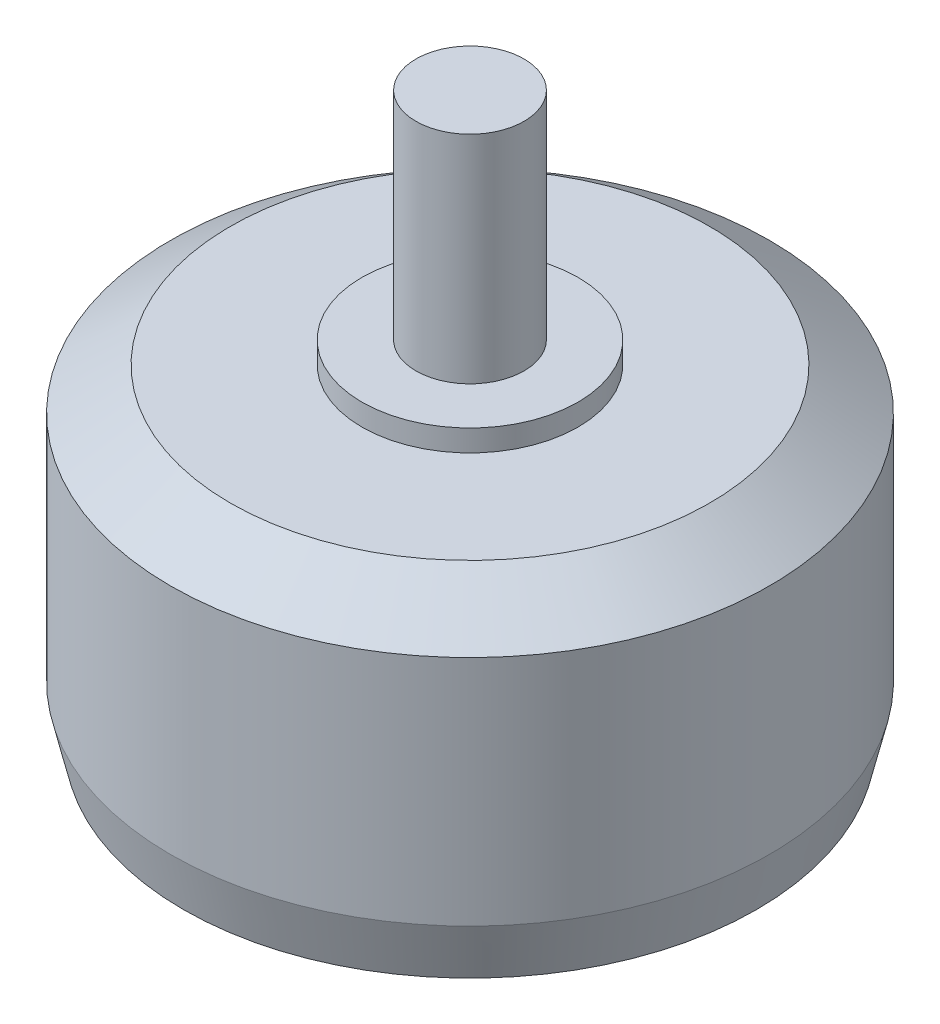
ISO-10303-21;
HEADER;
FILE_DESCRIPTION(('STEP AP214'),'2;1');
FILE_NAME('part.step','',(''),(''),'','','');
FILE_SCHEMA(('AUTOMOTIVE_DESIGN { 1 0 10303 214 1 1 1 1 }'));
ENDSEC;
DATA;
#1=APPLICATION_CONTEXT('core data for automotive mechanical design processes');
#2=APPLICATION_PROTOCOL_DEFINITION('international standard','automotive_design',2000,#1);
#3=PRODUCT_CONTEXT('',#1,'mechanical');
#4=PRODUCT('Part','Part','',(#3));
#5=PRODUCT_RELATED_PRODUCT_CATEGORY('part','',(#4));
#6=PRODUCT_DEFINITION_FORMATION('','',#4);
#7=PRODUCT_DEFINITION_CONTEXT('part definition',#1,'design');
#8=PRODUCT_DEFINITION('design','',#6,#7);
#9=PRODUCT_DEFINITION_SHAPE('','',#8);
#10=(LENGTH_UNIT() NAMED_UNIT(*) SI_UNIT(.MILLI.,.METRE.));
#11=(NAMED_UNIT(*) PLANE_ANGLE_UNIT() SI_UNIT($,.RADIAN.));
#12=(NAMED_UNIT(*) SI_UNIT($,.STERADIAN.) SOLID_ANGLE_UNIT());
#13=UNCERTAINTY_MEASURE_WITH_UNIT(LENGTH_MEASURE(1.E-05),#10,'distance_accuracy_value','');
#14=(GEOMETRIC_REPRESENTATION_CONTEXT(3) GLOBAL_UNCERTAINTY_ASSIGNED_CONTEXT((#13)) GLOBAL_UNIT_ASSIGNED_CONTEXT((#10,
#11,#12)) REPRESENTATION_CONTEXT('',''));
#15=CARTESIAN_POINT('',(0.,0.,0.));
#16=DIRECTION('',(0.,0.,1.));
#17=DIRECTION('',(1.,0.,0.));
#18=AXIS2_PLACEMENT_3D('',#15,#16,#17);
#19=CARTESIAN_POINT('',(0.,0.,0.));
#20=DIRECTION('',(0.,-1.,0.));
#21=DIRECTION('',(0.,0.,-1.));
#22=AXIS2_PLACEMENT_3D('',#19,#20,#21);
#23=PLANE('',#22);
#24=CARTESIAN_POINT('',(8.,0.,0.));
#25=DIRECTION('',(0.,-1.,0.));
#26=DIRECTION('',(0.,0.,-1.));
#27=AXIS2_PLACEMENT_3D('',#24,#25,#26);
#28=CIRCLE('',#27,1.);
#29=CARTESIAN_POINT('',(8.,0.,-1.));
#30=VERTEX_POINT('',#29);
#31=EDGE_CURVE('E82',#30,#30,#28,.T.);
#32=ORIENTED_EDGE('',*,*,#31,.F.);
#33=EDGE_LOOP('',(#32));
#34=FACE_BOUND('',#33,.T.);
#35=CARTESIAN_POINT('',(0.,0.,-6.));
#36=DIRECTION('',(0.,-1.,0.));
#37=DIRECTION('',(0.,0.,-1.));
#38=AXIS2_PLACEMENT_3D('',#35,#36,#37);
#39=CIRCLE('',#38,1.);
#40=CARTESIAN_POINT('',(0.,0.,-7.));
#41=VERTEX_POINT('',#40);
#42=EDGE_CURVE('E76',#41,#41,#39,.T.);
#43=ORIENTED_EDGE('',*,*,#42,.F.);
#44=EDGE_LOOP('',(#43));
#45=FACE_BOUND('',#44,.T.);
#46=CARTESIAN_POINT('',(-8.,0.,0.));
#47=DIRECTION('',(0.,-1.,0.));
#48=DIRECTION('',(0.,0.,-1.));
#49=AXIS2_PLACEMENT_3D('',#46,#47,#48);
#50=CIRCLE('',#49,1.);
#51=CARTESIAN_POINT('',(-8.,0.,-1.));
#52=VERTEX_POINT('',#51);
#53=EDGE_CURVE('E70',#52,#52,#50,.T.);
#54=ORIENTED_EDGE('',*,*,#53,.F.);
#55=EDGE_LOOP('',(#54));
#56=FACE_BOUND('',#55,.T.);
#57=CARTESIAN_POINT('',(0.,0.,6.));
#58=DIRECTION('',(0.,-1.,0.));
#59=DIRECTION('',(0.,0.,-1.));
#60=AXIS2_PLACEMENT_3D('',#57,#58,#59);
#61=CIRCLE('',#60,1.);
#62=CARTESIAN_POINT('',(0.,0.,5.));
#63=VERTEX_POINT('',#62);
#64=EDGE_CURVE('E64',#63,#63,#61,.T.);
#65=ORIENTED_EDGE('',*,*,#64,.F.);
#66=EDGE_LOOP('',(#65));
#67=FACE_BOUND('',#66,.T.);
#68=CARTESIAN_POINT('',(0.,0.,0.));
#69=DIRECTION('',(0.,1.,0.));
#70=DIRECTION('',(0.,0.,1.));
#71=AXIS2_PLACEMENT_3D('',#68,#69,#70);
#72=CIRCLE('',#71,13.2572796826854);
#73=CARTESIAN_POINT('',(0.,0.,13.2572796826854));
#74=VERTEX_POINT('',#73);
#75=EDGE_CURVE('E10',#74,#74,#72,.T.);
#76=ORIENTED_EDGE('',*,*,#75,.F.);
#77=EDGE_LOOP('',(#76));
#78=FACE_BOUND('',#77,.T.);
#79=ADVANCED_FACE('F32',(#34,#45,#56,#67,#78),#23,.T.);
#80=CARTESIAN_POINT('',(0.,2.5035491111513,0.));
#81=DIRECTION('',(0.,1.,0.));
#82=DIRECTION('',(0.,0.,1.));
#83=AXIS2_PLACEMENT_3D('',#80,#81,#82);
#84=CONICAL_SURFACE('',#83,13.85,0.23247164273145);
#85=ORIENTED_EDGE('',*,*,#75,.T.);
#86=EDGE_LOOP('',(#85));
#87=FACE_BOUND('',#86,.T.);
#88=CARTESIAN_POINT('',(0.,2.5035491111513,0.));
#89=DIRECTION('',(0.,1.,0.));
#90=DIRECTION('',(0.,0.,1.));
#91=AXIS2_PLACEMENT_3D('',#88,#89,#90);
#92=CIRCLE('',#91,13.85);
#93=CARTESIAN_POINT('',(0.,2.5035491111513,13.85));
#94=VERTEX_POINT('',#93);
#95=EDGE_CURVE('E38',#94,#94,#92,.T.);
#96=ORIENTED_EDGE('',*,*,#95,.F.);
#97=EDGE_LOOP('',(#96));
#98=FACE_BOUND('',#97,.T.);
#99=ADVANCED_FACE('F99',(#87,#98),#84,.T.);
#100=CARTESIAN_POINT('',(0.,26.2,0.));
#101=DIRECTION('',(0.,1.,0.));
#102=DIRECTION('',(0.,0.,1.));
#103=AXIS2_PLACEMENT_3D('',#100,#101,#102);
#104=CYLINDRICAL_SURFACE('',#103,13.85);
#105=ORIENTED_EDGE('',*,*,#95,.T.);
#106=EDGE_LOOP('',(#105));
#107=FACE_BOUND('',#106,.T.);
#108=CARTESIAN_POINT('',(0.,13.2610633285044,0.));
#109=DIRECTION('',(0.,1.,0.));
#110=DIRECTION('',(0.,0.,1.));
#111=AXIS2_PLACEMENT_3D('',#108,#109,#110);
#112=CIRCLE('',#111,13.85);
#113=CARTESIAN_POINT('',(0.,13.2610633285044,13.85));
#114=VERTEX_POINT('',#113);
#115=EDGE_CURVE('E42',#114,#114,#112,.T.);
#116=ORIENTED_EDGE('',*,*,#115,.F.);
#117=EDGE_LOOP('',(#116));
#118=FACE_BOUND('',#117,.T.);
#119=ADVANCED_FACE('F144',(#107,#118),#104,.T.);
#120=CARTESIAN_POINT('',(0.,15.2,0.));
#121=DIRECTION('',(0.,-1.,0.));
#122=DIRECTION('',(0.,0.,-1.));
#123=AXIS2_PLACEMENT_3D('',#120,#121,#122);
#124=CONICAL_SURFACE('',#123,11.0869417310102,0.958906402302683);
#125=ORIENTED_EDGE('',*,*,#115,.T.);
#126=EDGE_LOOP('',(#125));
#127=FACE_BOUND('',#126,.T.);
#128=CARTESIAN_POINT('',(0.,15.2,0.));
#129=DIRECTION('',(0.,1.,0.));
#130=DIRECTION('',(0.,0.,1.));
#131=AXIS2_PLACEMENT_3D('',#128,#129,#130);
#132=CIRCLE('',#131,11.0869417310102);
#133=CARTESIAN_POINT('',(0.,15.2,11.0869417310102));
#134=VERTEX_POINT('',#133);
#135=EDGE_CURVE('E46',#134,#134,#132,.T.);
#136=ORIENTED_EDGE('',*,*,#135,.F.);
#137=EDGE_LOOP('',(#136));
#138=FACE_BOUND('',#137,.T.);
#139=ADVANCED_FACE('F140',(#127,#138),#124,.T.);
#140=CARTESIAN_POINT('',(0.,15.2,11.0869417310102));
#141=DIRECTION('',(0.,1.,0.));
#142=DIRECTION('',(0.,0.,1.));
#143=AXIS2_PLACEMENT_3D('',#140,#141,#142);
#144=PLANE('',#143);
#145=ORIENTED_EDGE('',*,*,#135,.T.);
#146=EDGE_LOOP('',(#145));
#147=FACE_BOUND('',#146,.T.);
#148=CARTESIAN_POINT('',(0.,15.2,0.));
#149=DIRECTION('',(0.,1.,0.));
#150=DIRECTION('',(0.,0.,1.));
#151=AXIS2_PLACEMENT_3D('',#148,#149,#150);
#152=CIRCLE('',#151,5.);
#153=CARTESIAN_POINT('',(0.,15.2,5.));
#154=VERTEX_POINT('',#153);
#155=EDGE_CURVE('E51',#154,#154,#152,.T.);
#156=ORIENTED_EDGE('',*,*,#155,.F.);
#157=EDGE_LOOP('',(#156));
#158=FACE_BOUND('',#157,.T.);
#159=ADVANCED_FACE('F136',(#147,#158),#144,.T.);
#160=CARTESIAN_POINT('',(0.,26.2,0.));
#161=DIRECTION('',(0.,1.,0.));
#162=DIRECTION('',(0.,0.,1.));
#163=AXIS2_PLACEMENT_3D('',#160,#161,#162);
#164=CYLINDRICAL_SURFACE('',#163,5.);
#165=ORIENTED_EDGE('',*,*,#155,.T.);
#166=EDGE_LOOP('',(#165));
#167=FACE_BOUND('',#166,.T.);
#168=CARTESIAN_POINT('',(0.,16.2,0.));
#169=DIRECTION('',(0.,1.,0.));
#170=DIRECTION('',(0.,0.,1.));
#171=AXIS2_PLACEMENT_3D('',#168,#169,#170);
#172=CIRCLE('',#171,5.);
#173=CARTESIAN_POINT('',(0.,16.2,5.));
#174=VERTEX_POINT('',#173);
#175=EDGE_CURVE('E54',#174,#174,#172,.T.);
#176=ORIENTED_EDGE('',*,*,#175,.F.);
#177=EDGE_LOOP('',(#176));
#178=FACE_BOUND('',#177,.T.);
#179=ADVANCED_FACE('F132',(#167,#178),#164,.T.);
#180=CARTESIAN_POINT('',(0.,16.2,5.));
#181=DIRECTION('',(0.,1.,0.));
#182=DIRECTION('',(0.,0.,1.));
#183=AXIS2_PLACEMENT_3D('',#180,#181,#182);
#184=PLANE('',#183);
#185=ORIENTED_EDGE('',*,*,#175,.T.);
#186=EDGE_LOOP('',(#185));
#187=FACE_BOUND('',#186,.T.);
#188=CARTESIAN_POINT('',(0.,16.2,0.));
#189=DIRECTION('',(0.,1.,0.));
#190=DIRECTION('',(0.,0.,1.));
#191=AXIS2_PLACEMENT_3D('',#188,#189,#190);
#192=CIRCLE('',#191,2.5);
#193=CARTESIAN_POINT('',(0.,16.2,2.5));
#194=VERTEX_POINT('',#193);
#195=EDGE_CURVE('E57',#194,#194,#192,.T.);
#196=ORIENTED_EDGE('',*,*,#195,.F.);
#197=EDGE_LOOP('',(#196));
#198=FACE_BOUND('',#197,.T.);
#199=ADVANCED_FACE('F128',(#187,#198),#184,.T.);
#200=CARTESIAN_POINT('',(0.,26.2,0.));
#201=DIRECTION('',(0.,1.,0.));
#202=DIRECTION('',(0.,0.,1.));
#203=AXIS2_PLACEMENT_3D('',#200,#201,#202);
#204=CYLINDRICAL_SURFACE('',#203,2.5);
#205=ORIENTED_EDGE('',*,*,#195,.T.);
#206=EDGE_LOOP('',(#205));
#207=FACE_BOUND('',#206,.T.);
#208=CARTESIAN_POINT('',(0.,26.2,0.));
#209=DIRECTION('',(0.,1.,0.));
#210=DIRECTION('',(0.,0.,1.));
#211=AXIS2_PLACEMENT_3D('',#208,#209,#210);
#212=CIRCLE('',#211,2.5);
#213=CARTESIAN_POINT('',(0.,26.2,2.5));
#214=VERTEX_POINT('',#213);
#215=EDGE_CURVE('E60',#214,#214,#212,.T.);
#216=ORIENTED_EDGE('',*,*,#215,.F.);
#217=EDGE_LOOP('',(#216));
#218=FACE_BOUND('',#217,.T.);
#219=ADVANCED_FACE('F120',(#207,#218),#204,.T.);
#220=CARTESIAN_POINT('',(0.,26.2,2.5));
#221=DIRECTION('',(0.,1.,0.));
#222=DIRECTION('',(0.,0.,1.));
#223=AXIS2_PLACEMENT_3D('',#220,#221,#222);
#224=PLANE('',#223);
#225=ORIENTED_EDGE('',*,*,#215,.T.);
#226=EDGE_LOOP('',(#225));
#227=FACE_BOUND('',#226,.T.);
#228=ADVANCED_FACE('F110',(#227),#224,.T.);
#229=CARTESIAN_POINT('',(0.,10.16,6.));
#230=DIRECTION('',(0.,-1.,0.));
#231=DIRECTION('',(0.,0.,-1.));
#232=AXIS2_PLACEMENT_3D('',#229,#230,#231);
#233=CYLINDRICAL_SURFACE('',#232,1.);
#234=CARTESIAN_POINT('',(0.,10.16,6.));
#235=DIRECTION('',(0.,-1.,0.));
#236=DIRECTION('',(0.,0.,-1.));
#237=AXIS2_PLACEMENT_3D('',#234,#235,#236);
#238=CIRCLE('',#237,1.);
#239=CARTESIAN_POINT('',(0.,10.16,5.));
#240=VERTEX_POINT('',#239);
#241=EDGE_CURVE('E63',#240,#240,#238,.T.);
#242=ORIENTED_EDGE('',*,*,#241,.F.);
#243=EDGE_LOOP('',(#242));
#244=FACE_BOUND('',#243,.T.);
#245=ORIENTED_EDGE('',*,*,#64,.T.);
#246=EDGE_LOOP('',(#245));
#247=FACE_BOUND('',#246,.T.);
#248=ADVANCED_FACE('F107',(#244,#247),#233,.F.);
#249=CARTESIAN_POINT('',(0.,10.16,6.));
#250=DIRECTION('',(0.,-1.,0.));
#251=DIRECTION('',(0.,0.,-1.));
#252=AXIS2_PLACEMENT_3D('',#249,#250,#251);
#253=PLANE('',#252);
#254=ORIENTED_EDGE('',*,*,#241,.T.);
#255=EDGE_LOOP('',(#254));
#256=FACE_BOUND('',#255,.T.);
#257=ADVANCED_FACE('F109',(#256),#253,.T.);
#258=CARTESIAN_POINT('',(-8.,10.16,0.));
#259=DIRECTION('',(0.,-1.,0.));
#260=DIRECTION('',(0.,0.,-1.));
#261=AXIS2_PLACEMENT_3D('',#258,#259,#260);
#262=CYLINDRICAL_SURFACE('',#261,1.);
#263=CARTESIAN_POINT('',(-8.,10.16,0.));
#264=DIRECTION('',(0.,-1.,0.));
#265=DIRECTION('',(0.,0.,-1.));
#266=AXIS2_PLACEMENT_3D('',#263,#264,#265);
#267=CIRCLE('',#266,1.);
#268=CARTESIAN_POINT('',(-8.,10.16,-0.999999999999999));
#269=VERTEX_POINT('',#268);
#270=EDGE_CURVE('E73',#269,#269,#267,.T.);
#271=ORIENTED_EDGE('',*,*,#270,.F.);
#272=EDGE_LOOP('',(#271));
#273=FACE_BOUND('',#272,.T.);
#274=ORIENTED_EDGE('',*,*,#53,.T.);
#275=EDGE_LOOP('',(#274));
#276=FACE_BOUND('',#275,.T.);
#277=ADVANCED_FACE('F117',(#273,#276),#262,.F.);
#278=CARTESIAN_POINT('',(-8.,10.16,0.));
#279=DIRECTION('',(0.,-1.,0.));
#280=DIRECTION('',(0.,0.,-1.));
#281=AXIS2_PLACEMENT_3D('',#278,#279,#280);
#282=PLANE('',#281);
#283=ORIENTED_EDGE('',*,*,#270,.T.);
#284=EDGE_LOOP('',(#283));
#285=FACE_BOUND('',#284,.T.);
#286=ADVANCED_FACE('F204',(#285),#282,.T.);
#287=CARTESIAN_POINT('',(0.,10.16,-6.));
#288=DIRECTION('',(0.,-1.,0.));
#289=DIRECTION('',(0.,0.,-1.));
#290=AXIS2_PLACEMENT_3D('',#287,#288,#289);
#291=CYLINDRICAL_SURFACE('',#290,1.);
#292=CARTESIAN_POINT('',(0.,10.16,-6.));
#293=DIRECTION('',(0.,-1.,0.));
#294=DIRECTION('',(0.,0.,-1.));
#295=AXIS2_PLACEMENT_3D('',#292,#293,#294);
#296=CIRCLE('',#295,1.);
#297=CARTESIAN_POINT('',(0.,10.16,-7.));
#298=VERTEX_POINT('',#297);
#299=EDGE_CURVE('E79',#298,#298,#296,.T.);
#300=ORIENTED_EDGE('',*,*,#299,.F.);
#301=EDGE_LOOP('',(#300));
#302=FACE_BOUND('',#301,.T.);
#303=ORIENTED_EDGE('',*,*,#42,.T.);
#304=EDGE_LOOP('',(#303));
#305=FACE_BOUND('',#304,.T.);
#306=ADVANCED_FACE('F213',(#302,#305),#291,.F.);
#307=CARTESIAN_POINT('',(0.,10.16,-6.));
#308=DIRECTION('',(0.,-1.,0.));
#309=DIRECTION('',(0.,0.,-1.));
#310=AXIS2_PLACEMENT_3D('',#307,#308,#309);
#311=PLANE('',#310);
#312=ORIENTED_EDGE('',*,*,#299,.T.);
#313=EDGE_LOOP('',(#312));
#314=FACE_BOUND('',#313,.T.);
#315=ADVANCED_FACE('F93',(#314),#311,.T.);
#316=CARTESIAN_POINT('',(8.,10.16,0.));
#317=DIRECTION('',(0.,-1.,0.));
#318=DIRECTION('',(0.,0.,-1.));
#319=AXIS2_PLACEMENT_3D('',#316,#317,#318);
#320=CYLINDRICAL_SURFACE('',#319,1.);
#321=CARTESIAN_POINT('',(8.,10.16,0.));
#322=DIRECTION('',(0.,-1.,0.));
#323=DIRECTION('',(0.,0.,-1.));
#324=AXIS2_PLACEMENT_3D('',#321,#322,#323);
#325=CIRCLE('',#324,1.);
#326=CARTESIAN_POINT('',(8.,10.16,-1.));
#327=VERTEX_POINT('',#326);
#328=EDGE_CURVE('E67',#327,#327,#325,.T.);
#329=ORIENTED_EDGE('',*,*,#328,.F.);
#330=EDGE_LOOP('',(#329));
#331=FACE_BOUND('',#330,.T.);
#332=ORIENTED_EDGE('',*,*,#31,.T.);
#333=EDGE_LOOP('',(#332));
#334=FACE_BOUND('',#333,.T.);
#335=ADVANCED_FACE('F90',(#331,#334),#320,.F.);
#336=CARTESIAN_POINT('',(8.,10.16,0.));
#337=DIRECTION('',(0.,-1.,0.));
#338=DIRECTION('',(0.,0.,-1.));
#339=AXIS2_PLACEMENT_3D('',#336,#337,#338);
#340=PLANE('',#339);
#341=ORIENTED_EDGE('',*,*,#328,.T.);
#342=EDGE_LOOP('',(#341));
#343=FACE_BOUND('',#342,.T.);
#344=ADVANCED_FACE('F88',(#343),#340,.T.);
#345=CLOSED_SHELL('',(#79,#99,#119,#139,#159,#179,#199,#219,#228,#248,#257,#277,#286,#306,#315,
#335,#344));
#346=MANIFOLD_SOLID_BREP('B2',#345);
#347=ADVANCED_BREP_SHAPE_REPRESENTATION('',(#18,#346),#14);
#348=SHAPE_DEFINITION_REPRESENTATION(#9,#347);
ENDSEC;
END-ISO-10303-21;
